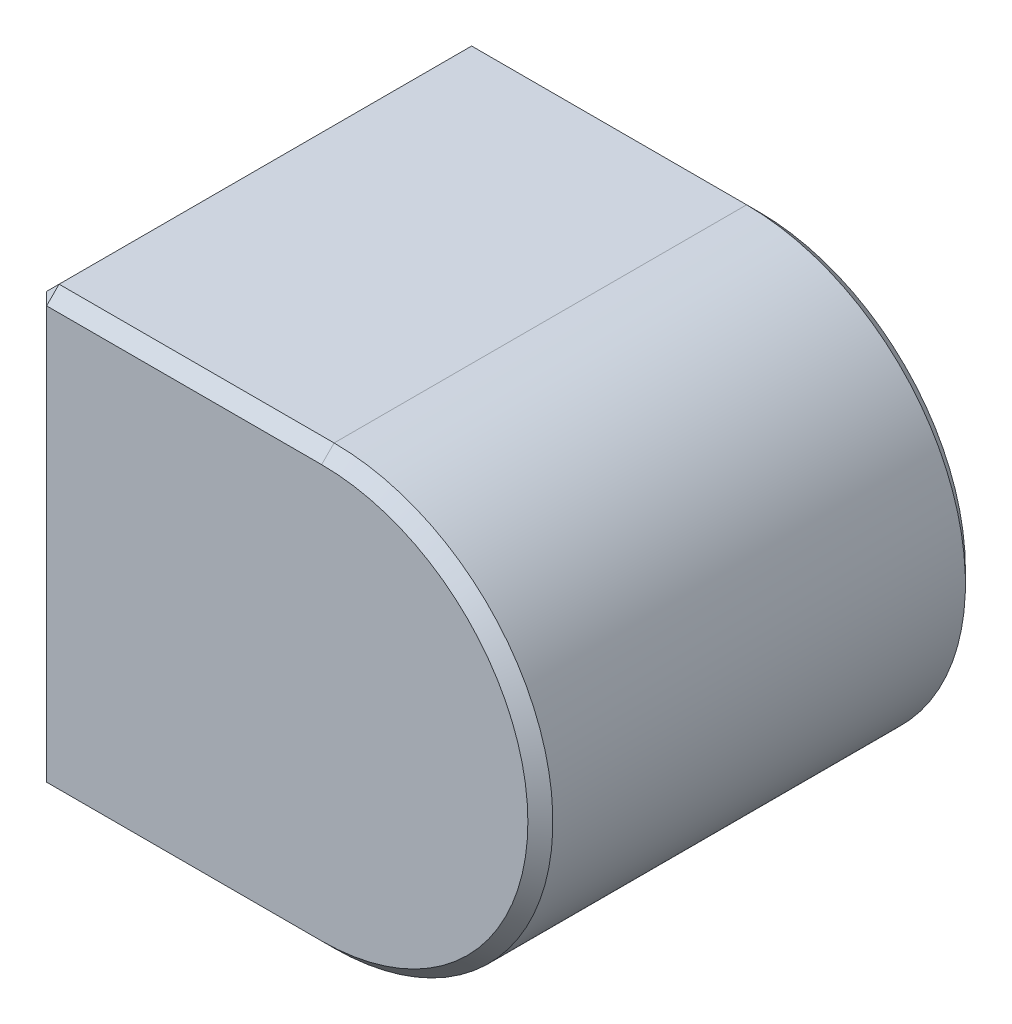
ISO-10303-21;
HEADER;
FILE_DESCRIPTION(('STEP AP214'),'2;1');
FILE_NAME('part.step','',(''),(''),'','','');
FILE_SCHEMA(('AUTOMOTIVE_DESIGN { 1 0 10303 214 1 1 1 1 }'));
ENDSEC;
DATA;
#1=APPLICATION_CONTEXT('core data for automotive mechanical design processes');
#2=APPLICATION_PROTOCOL_DEFINITION('international standard','automotive_design',2000,#1);
#3=PRODUCT_CONTEXT('',#1,'mechanical');
#4=PRODUCT('Part','Part','',(#3));
#5=PRODUCT_RELATED_PRODUCT_CATEGORY('part','',(#4));
#6=PRODUCT_DEFINITION_FORMATION('','',#4);
#7=PRODUCT_DEFINITION_CONTEXT('part definition',#1,'design');
#8=PRODUCT_DEFINITION('design','',#6,#7);
#9=PRODUCT_DEFINITION_SHAPE('','',#8);
#10=(LENGTH_UNIT() NAMED_UNIT(*) SI_UNIT(.MILLI.,.METRE.));
#11=(NAMED_UNIT(*) PLANE_ANGLE_UNIT() SI_UNIT($,.RADIAN.));
#12=(NAMED_UNIT(*) SI_UNIT($,.STERADIAN.) SOLID_ANGLE_UNIT());
#13=UNCERTAINTY_MEASURE_WITH_UNIT(LENGTH_MEASURE(1.E-05),#10,'distance_accuracy_value','');
#14=(GEOMETRIC_REPRESENTATION_CONTEXT(3) GLOBAL_UNCERTAINTY_ASSIGNED_CONTEXT((#13)) GLOBAL_UNIT_ASSIGNED_CONTEXT((#10,
#11,#12)) REPRESENTATION_CONTEXT('',''));
#15=CARTESIAN_POINT('',(0.,0.,0.));
#16=DIRECTION('',(0.,0.,1.));
#17=DIRECTION('',(1.,0.,0.));
#18=AXIS2_PLACEMENT_3D('',#15,#16,#17);
#19=CARTESIAN_POINT('',(0.,0.,70.));
#20=DIRECTION('',(0.,0.,-1.));
#21=DIRECTION('',(1.,0.,0.));
#22=AXIS2_PLACEMENT_3D('',#19,#20,#21);
#23=CYLINDRICAL_SURFACE('',#22,35.);
#24=DIRECTION('',(0.,0.,-1.));
#25=VECTOR('',#24,1.);
#26=CARTESIAN_POINT('',(0.,35.,70.));
#27=LINE('',#26,#25);
#28=CARTESIAN_POINT('',(0.,35.,68.));
#29=VERTEX_POINT('',#28);
#30=CARTESIAN_POINT('',(0.,35.,2.));
#31=VERTEX_POINT('',#30);
#32=EDGE_CURVE('E147',#29,#31,#27,.T.);
#33=ORIENTED_EDGE('',*,*,#32,.F.);
#34=CARTESIAN_POINT('',(0.,0.,68.));
#35=DIRECTION('',(0.,0.,-1.));
#36=DIRECTION('',(-1.,0.,0.));
#37=AXIS2_PLACEMENT_3D('',#34,#35,#36);
#38=CIRCLE('',#37,35.);
#39=CARTESIAN_POINT('',(0.,-35.,68.));
#40=VERTEX_POINT('',#39);
#41=EDGE_CURVE('E116',#40,#29,#38,.F.);
#42=ORIENTED_EDGE('',*,*,#41,.F.);
#43=DIRECTION('',(0.,0.,-1.));
#44=VECTOR('',#43,1.);
#45=CARTESIAN_POINT('',(0.,-35.,70.));
#46=LINE('',#45,#44);
#47=CARTESIAN_POINT('',(0.,-35.,2.));
#48=VERTEX_POINT('',#47);
#49=EDGE_CURVE('E141',#40,#48,#46,.T.);
#50=ORIENTED_EDGE('',*,*,#49,.T.);
#51=CARTESIAN_POINT('',(0.,0.,2.));
#52=DIRECTION('',(0.,0.,-1.));
#53=DIRECTION('',(-1.,0.,0.));
#54=AXIS2_PLACEMENT_3D('',#51,#52,#53);
#55=CIRCLE('',#54,35.);
#56=EDGE_CURVE('E150',#31,#48,#55,.T.);
#57=ORIENTED_EDGE('',*,*,#56,.F.);
#58=EDGE_LOOP('',(#33,#42,#50,#57));
#59=FACE_BOUND('',#58,.T.);
#60=ADVANCED_FACE('F32',(#59),#23,.T.);
#61=CARTESIAN_POINT('',(-46.,-35.,70.));
#62=DIRECTION('',(0.,1.,0.));
#63=DIRECTION('',(1.,0.,0.));
#64=AXIS2_PLACEMENT_3D('',#61,#62,#63);
#65=PLANE('',#64);
#66=ORIENTED_EDGE('',*,*,#49,.F.);
#67=DIRECTION('',(1.,0.,0.));
#68=VECTOR('',#67,1.);
#69=CARTESIAN_POINT('',(0.,-35.,68.));
#70=LINE('',#69,#68);
#71=CARTESIAN_POINT('',(-44.,-35.,68.));
#72=VERTEX_POINT('',#71);
#73=EDGE_CURVE('E128',#72,#40,#70,.T.);
#74=ORIENTED_EDGE('',*,*,#73,.F.);
#75=DIRECTION('',(0.,0.,1.));
#76=VECTOR('',#75,1.);
#77=CARTESIAN_POINT('',(-44.,-35.,70.));
#78=LINE('',#77,#76);
#79=CARTESIAN_POINT('',(-44.,-35.,2.));
#80=VERTEX_POINT('',#79);
#81=EDGE_CURVE('E137',#80,#72,#78,.T.);
#82=ORIENTED_EDGE('',*,*,#81,.F.);
#83=DIRECTION('',(-1.,0.,0.));
#84=VECTOR('',#83,1.);
#85=CARTESIAN_POINT('',(-46.,-35.,2.));
#86=LINE('',#85,#84);
#87=EDGE_CURVE('E136',#48,#80,#86,.T.);
#88=ORIENTED_EDGE('',*,*,#87,.F.);
#89=EDGE_LOOP('',(#66,#74,#82,#88));
#90=FACE_BOUND('',#89,.T.);
#91=ADVANCED_FACE('F142',(#90),#65,.F.);
#92=CARTESIAN_POINT('',(-46.,35.,70.));
#93=DIRECTION('',(1.,0.,0.));
#94=DIRECTION('',(0.,0.,1.));
#95=AXIS2_PLACEMENT_3D('',#92,#93,#94);
#96=PLANE('',#95);
#97=CARTESIAN_POINT('',(-46.,0.,38.));
#98=DIRECTION('',(-1.,0.,0.));
#99=DIRECTION('',(0.,0.,1.));
#100=AXIS2_PLACEMENT_3D('',#97,#98,#99);
#101=CIRCLE('',#100,26.);
#102=CARTESIAN_POINT('',(-46.,0.,64.));
#103=VERTEX_POINT('',#102);
#104=EDGE_CURVE('E40',#103,#103,#101,.T.);
#105=ORIENTED_EDGE('',*,*,#104,.F.);
#106=EDGE_LOOP('',(#105));
#107=FACE_BOUND('',#106,.T.);
#108=DIRECTION('',(0.,-1.,0.));
#109=VECTOR('',#108,1.);
#110=CARTESIAN_POINT('',(-46.,-35.,68.));
#111=LINE('',#110,#109);
#112=CARTESIAN_POINT('',(-46.,33.,68.));
#113=VERTEX_POINT('',#112);
#114=CARTESIAN_POINT('',(-46.,-33.,68.));
#115=VERTEX_POINT('',#114);
#116=EDGE_CURVE('E153',#113,#115,#111,.T.);
#117=ORIENTED_EDGE('',*,*,#116,.F.);
#118=DIRECTION('',(0.,0.,1.));
#119=VECTOR('',#118,1.);
#120=CARTESIAN_POINT('',(-46.,33.,70.));
#121=LINE('',#120,#119);
#122=CARTESIAN_POINT('',(-46.,33.,1.99999999999999));
#123=VERTEX_POINT('',#122);
#124=EDGE_CURVE('E160',#123,#113,#121,.T.);
#125=ORIENTED_EDGE('',*,*,#124,.F.);
#126=DIRECTION('',(0.,1.,0.));
#127=VECTOR('',#126,1.);
#128=CARTESIAN_POINT('',(-46.,35.,1.99999999999999));
#129=LINE('',#128,#127);
#130=CARTESIAN_POINT('',(-46.,-33.,1.99999999999999));
#131=VERTEX_POINT('',#130);
#132=EDGE_CURVE('E162',#131,#123,#129,.T.);
#133=ORIENTED_EDGE('',*,*,#132,.F.);
#134=DIRECTION('',(0.,0.,-1.));
#135=VECTOR('',#134,1.);
#136=CARTESIAN_POINT('',(-46.,-33.,70.));
#137=LINE('',#136,#135);
#138=EDGE_CURVE('E165',#115,#131,#137,.T.);
#139=ORIENTED_EDGE('',*,*,#138,.F.);
#140=EDGE_LOOP('',(#117,#125,#133,#139));
#141=FACE_BOUND('',#140,.T.);
#142=ADVANCED_FACE('F226',(#107,#141),#96,.F.);
#143=CARTESIAN_POINT('',(0.,35.,70.));
#144=DIRECTION('',(0.,-1.,0.));
#145=DIRECTION('',(-1.,0.,0.));
#146=AXIS2_PLACEMENT_3D('',#143,#144,#145);
#147=PLANE('',#146);
#148=DIRECTION('',(0.,0.,-1.));
#149=VECTOR('',#148,1.);
#150=CARTESIAN_POINT('',(-44.,35.,70.));
#151=LINE('',#150,#149);
#152=CARTESIAN_POINT('',(-44.,35.,68.));
#153=VERTEX_POINT('',#152);
#154=CARTESIAN_POINT('',(-44.,35.,2.));
#155=VERTEX_POINT('',#154);
#156=EDGE_CURVE('E171',#153,#155,#151,.T.);
#157=ORIENTED_EDGE('',*,*,#156,.F.);
#158=DIRECTION('',(-1.,0.,0.));
#159=VECTOR('',#158,1.);
#160=CARTESIAN_POINT('',(-46.,35.,68.));
#161=LINE('',#160,#159);
#162=EDGE_CURVE('E168',#29,#153,#161,.T.);
#163=ORIENTED_EDGE('',*,*,#162,.F.);
#164=ORIENTED_EDGE('',*,*,#32,.T.);
#165=DIRECTION('',(1.,0.,0.));
#166=VECTOR('',#165,1.);
#167=CARTESIAN_POINT('',(0.,35.,2.));
#168=LINE('',#167,#166);
#169=EDGE_CURVE('E173',#155,#31,#168,.T.);
#170=ORIENTED_EDGE('',*,*,#169,.F.);
#171=EDGE_LOOP('',(#157,#163,#164,#170));
#172=FACE_BOUND('',#171,.T.);
#173=ADVANCED_FACE('F229',(#172),#147,.F.);
#174=CARTESIAN_POINT('',(0.,0.,70.));
#175=DIRECTION('',(0.,0.,1.));
#176=DIRECTION('',(-1.,0.,0.));
#177=AXIS2_PLACEMENT_3D('',#174,#175,#176);
#178=PLANE('',#177);
#179=CARTESIAN_POINT('',(0.,0.,70.));
#180=DIRECTION('',(0.,0.,-1.));
#181=DIRECTION('',(-1.,0.,0.));
#182=AXIS2_PLACEMENT_3D('',#179,#180,#181);
#183=CIRCLE('',#182,33.);
#184=CARTESIAN_POINT('',(0.,33.,70.));
#185=VERTEX_POINT('',#184);
#186=CARTESIAN_POINT('',(0.,-33.,70.));
#187=VERTEX_POINT('',#186);
#188=EDGE_CURVE('E119',#185,#187,#183,.T.);
#189=ORIENTED_EDGE('',*,*,#188,.F.);
#190=DIRECTION('',(1.,0.,0.));
#191=VECTOR('',#190,1.);
#192=CARTESIAN_POINT('',(0.,33.,70.));
#193=LINE('',#192,#191);
#194=CARTESIAN_POINT('',(-44.,33.,70.));
#195=VERTEX_POINT('',#194);
#196=EDGE_CURVE('E266',#195,#185,#193,.T.);
#197=ORIENTED_EDGE('',*,*,#196,.F.);
#198=DIRECTION('',(0.,1.,0.));
#199=VECTOR('',#198,1.);
#200=CARTESIAN_POINT('',(-44.,35.,70.));
#201=LINE('',#200,#199);
#202=CARTESIAN_POINT('',(-44.,-33.,70.));
#203=VERTEX_POINT('',#202);
#204=EDGE_CURVE('E240',#203,#195,#201,.T.);
#205=ORIENTED_EDGE('',*,*,#204,.F.);
#206=DIRECTION('',(-1.,0.,0.));
#207=VECTOR('',#206,1.);
#208=CARTESIAN_POINT('',(-46.,-33.,70.));
#209=LINE('',#208,#207);
#210=EDGE_CURVE('E151',#187,#203,#209,.T.);
#211=ORIENTED_EDGE('',*,*,#210,.F.);
#212=EDGE_LOOP('',(#189,#197,#205,#211));
#213=FACE_BOUND('',#212,.T.);
#214=ADVANCED_FACE('F264',(#213),#178,.T.);
#215=CARTESIAN_POINT('',(0.,0.,0.));
#216=DIRECTION('',(0.,0.,1.));
#217=DIRECTION('',(-1.,0.,0.));
#218=AXIS2_PLACEMENT_3D('',#215,#216,#217);
#219=PLANE('',#218);
#220=CARTESIAN_POINT('',(0.,0.,0.));
#221=DIRECTION('',(0.,0.,-1.));
#222=DIRECTION('',(-1.,0.,0.));
#223=AXIS2_PLACEMENT_3D('',#220,#221,#222);
#224=CIRCLE('',#223,27.);
#225=CARTESIAN_POINT('',(-27.,0.,0.));
#226=VERTEX_POINT('',#225);
#227=EDGE_CURVE('E11',#226,#226,#224,.T.);
#228=ORIENTED_EDGE('',*,*,#227,.F.);
#229=EDGE_LOOP('',(#228));
#230=FACE_BOUND('',#229,.T.);
#231=DIRECTION('',(0.,-1.,0.));
#232=VECTOR('',#231,1.);
#233=CARTESIAN_POINT('',(-44.,0.,0.));
#234=LINE('',#233,#232);
#235=CARTESIAN_POINT('',(-44.,33.,0.));
#236=VERTEX_POINT('',#235);
#237=CARTESIAN_POINT('',(-44.,-33.,0.));
#238=VERTEX_POINT('',#237);
#239=EDGE_CURVE('E255',#236,#238,#234,.T.);
#240=ORIENTED_EDGE('',*,*,#239,.F.);
#241=DIRECTION('',(-1.,0.,0.));
#242=VECTOR('',#241,1.);
#243=CARTESIAN_POINT('',(0.,33.,0.));
#244=LINE('',#243,#242);
#245=CARTESIAN_POINT('',(0.,33.,0.));
#246=VERTEX_POINT('',#245);
#247=EDGE_CURVE('E277',#246,#236,#244,.T.);
#248=ORIENTED_EDGE('',*,*,#247,.F.);
#249=CARTESIAN_POINT('',(0.,0.,0.));
#250=DIRECTION('',(0.,0.,-1.));
#251=DIRECTION('',(-1.,0.,0.));
#252=AXIS2_PLACEMENT_3D('',#249,#250,#251);
#253=CIRCLE('',#252,33.);
#254=CARTESIAN_POINT('',(0.,-33.,0.));
#255=VERTEX_POINT('',#254);
#256=EDGE_CURVE('E273',#255,#246,#253,.F.);
#257=ORIENTED_EDGE('',*,*,#256,.F.);
#258=DIRECTION('',(1.,0.,0.));
#259=VECTOR('',#258,1.);
#260=CARTESIAN_POINT('',(0.,-33.,0.));
#261=LINE('',#260,#259);
#262=EDGE_CURVE('E268',#238,#255,#261,.T.);
#263=ORIENTED_EDGE('',*,*,#262,.F.);
#264=EDGE_LOOP('',(#240,#248,#257,#263));
#265=FACE_BOUND('',#264,.T.);
#266=ADVANCED_FACE('F480',(#230,#265),#219,.F.);
#267=CARTESIAN_POINT('',(-51.,0.,38.));
#268=DIRECTION('',(1.,0.,0.));
#269=DIRECTION('',(0.,0.,1.));
#270=AXIS2_PLACEMENT_3D('',#267,#268,#269);
#271=CYLINDRICAL_SURFACE('',#270,25.);
#272=CARTESIAN_POINT('',(-50.,0.,38.));
#273=DIRECTION('',(1.,0.,0.));
#274=DIRECTION('',(0.,0.,-1.));
#275=AXIS2_PLACEMENT_3D('',#272,#273,#274);
#276=CIRCLE('',#275,25.);
#277=CARTESIAN_POINT('',(-50.,0.,13.));
#278=VERTEX_POINT('',#277);
#279=EDGE_CURVE('E218',#278,#278,#276,.F.);
#280=ORIENTED_EDGE('',*,*,#279,.F.);
#281=EDGE_LOOP('',(#280));
#282=FACE_BOUND('',#281,.T.);
#283=CARTESIAN_POINT('',(-47.,0.,38.));
#284=DIRECTION('',(-1.,0.,0.));
#285=DIRECTION('',(0.,0.,1.));
#286=AXIS2_PLACEMENT_3D('',#283,#284,#285);
#287=CIRCLE('',#286,25.);
#288=CARTESIAN_POINT('',(-47.,0.,63.));
#289=VERTEX_POINT('',#288);
#290=EDGE_CURVE('E215',#289,#289,#287,.F.);
#291=ORIENTED_EDGE('',*,*,#290,.F.);
#292=EDGE_LOOP('',(#291));
#293=FACE_BOUND('',#292,.T.);
#294=ADVANCED_FACE('F293',(#282,#293),#271,.T.);
#295=CARTESIAN_POINT('',(-51.,0.,38.));
#296=DIRECTION('',(-1.,0.,0.));
#297=DIRECTION('',(0.,0.,-1.));
#298=AXIS2_PLACEMENT_3D('',#295,#296,#297);
#299=PLANE('',#298);
#300=CARTESIAN_POINT('',(-51.,0.,38.));
#301=DIRECTION('',(1.,0.,0.));
#302=DIRECTION('',(0.,0.,-1.));
#303=AXIS2_PLACEMENT_3D('',#300,#301,#302);
#304=CIRCLE('',#303,24.);
#305=CARTESIAN_POINT('',(-51.,0.,14.));
#306=VERTEX_POINT('',#305);
#307=EDGE_CURVE('E212',#306,#306,#304,.T.);
#308=ORIENTED_EDGE('',*,*,#307,.F.);
#309=EDGE_LOOP('',(#308));
#310=FACE_BOUND('',#309,.T.);
#311=ADVANCED_FACE('F286',(#310),#299,.T.);
#312=CARTESIAN_POINT('',(0.,33.,70.));
#313=DIRECTION('',(0.,0.70710678118655,0.707106781186545));
#314=DIRECTION('',(-1.,0.,0.));
#315=AXIS2_PLACEMENT_3D('',#312,#313,#314);
#316=PLANE('',#315);
#317=DIRECTION('',(0.,-0.707106781186545,0.70710678118655));
#318=VECTOR('',#317,1.);
#319=CARTESIAN_POINT('',(-44.,34.,69.));
#320=LINE('',#319,#318);
#321=EDGE_CURVE('E123',#153,#195,#320,.T.);
#322=ORIENTED_EDGE('',*,*,#321,.T.);
#323=ORIENTED_EDGE('',*,*,#196,.T.);
#324=DIRECTION('',(0.,0.707106781186545,-0.70710678118655));
#325=VECTOR('',#324,1.);
#326=CARTESIAN_POINT('',(0.,33.,70.));
#327=LINE('',#326,#325);
#328=EDGE_CURVE('E202',#185,#29,#327,.T.);
#329=ORIENTED_EDGE('',*,*,#328,.T.);
#330=ORIENTED_EDGE('',*,*,#162,.T.);
#331=EDGE_LOOP('',(#322,#323,#329,#330));
#332=FACE_BOUND('',#331,.T.);
#333=ADVANCED_FACE('F284',(#332),#316,.T.);
#334=CARTESIAN_POINT('',(0.,0.,70.));
#335=DIRECTION('',(0.,0.,-1.));
#336=DIRECTION('',(1.,0.,0.));
#337=AXIS2_PLACEMENT_3D('',#334,#335,#336);
#338=CONICAL_SURFACE('',#337,33.,0.785398163397445);
#339=ORIENTED_EDGE('',*,*,#328,.F.);
#340=ORIENTED_EDGE('',*,*,#188,.T.);
#341=DIRECTION('',(0.,-0.707106781186545,-0.70710678118655));
#342=VECTOR('',#341,1.);
#343=CARTESIAN_POINT('',(0.,-33.,70.));
#344=LINE('',#343,#342);
#345=EDGE_CURVE('E112',#187,#40,#344,.T.);
#346=ORIENTED_EDGE('',*,*,#345,.T.);
#347=ORIENTED_EDGE('',*,*,#41,.T.);
#348=EDGE_LOOP('',(#339,#340,#346,#347));
#349=FACE_BOUND('',#348,.T.);
#350=ADVANCED_FACE('F114',(#349),#338,.T.);
#351=CARTESIAN_POINT('',(-46.,33.,68.));
#352=DIRECTION('',(-0.577350269189626,0.57735026918963,0.577350269189622));
#353=DIRECTION('',(0.70710678118655,0.707106781186545,0.));
#354=AXIS2_PLACEMENT_3D('',#351,#352,#353);
#355=PLANE('',#354);
#356=DIRECTION('',(-0.70710678118655,-0.707106781186545,0.));
#357=VECTOR('',#356,1.);
#358=CARTESIAN_POINT('',(-46.,33.,68.));
#359=LINE('',#358,#357);
#360=EDGE_CURVE('E55',#153,#113,#359,.T.);
#361=ORIENTED_EDGE('',*,*,#360,.T.);
#362=DIRECTION('',(-0.707106781186545,0.,-0.70710678118655));
#363=VECTOR('',#362,1.);
#364=CARTESIAN_POINT('',(-46.,33.,68.));
#365=LINE('',#364,#363);
#366=EDGE_CURVE('E124',#113,#195,#365,.F.);
#367=ORIENTED_EDGE('',*,*,#366,.T.);
#368=ORIENTED_EDGE('',*,*,#321,.F.);
#369=EDGE_LOOP('',(#361,#367,#368));
#370=FACE_BOUND('',#369,.T.);
#371=ADVANCED_FACE('F243',(#370),#355,.T.);
#372=CARTESIAN_POINT('',(0.,-33.,70.));
#373=DIRECTION('',(0.,-0.70710678118655,0.707106781186545));
#374=DIRECTION('',(1.,0.,0.));
#375=AXIS2_PLACEMENT_3D('',#372,#373,#374);
#376=PLANE('',#375);
#377=ORIENTED_EDGE('',*,*,#345,.F.);
#378=ORIENTED_EDGE('',*,*,#210,.T.);
#379=DIRECTION('',(0.,-0.707106781186545,-0.70710678118655));
#380=VECTOR('',#379,1.);
#381=CARTESIAN_POINT('',(-44.,-33.,70.));
#382=LINE('',#381,#380);
#383=EDGE_CURVE('E132',#203,#72,#382,.T.);
#384=ORIENTED_EDGE('',*,*,#383,.T.);
#385=ORIENTED_EDGE('',*,*,#73,.T.);
#386=EDGE_LOOP('',(#377,#378,#384,#385));
#387=FACE_BOUND('',#386,.T.);
#388=ADVANCED_FACE('F130',(#387),#376,.T.);
#389=CARTESIAN_POINT('',(-44.,0.,70.));
#390=DIRECTION('',(-0.70710678118655,0.,0.707106781186545));
#391=DIRECTION('',(0.,-1.,0.));
#392=AXIS2_PLACEMENT_3D('',#389,#390,#391);
#393=PLANE('',#392);
#394=ORIENTED_EDGE('',*,*,#366,.F.);
#395=ORIENTED_EDGE('',*,*,#116,.T.);
#396=DIRECTION('',(0.707106781186545,0.,0.70710678118655));
#397=VECTOR('',#396,1.);
#398=CARTESIAN_POINT('',(-44.,-33.,70.));
#399=LINE('',#398,#397);
#400=EDGE_CURVE('E195',#115,#203,#399,.T.);
#401=ORIENTED_EDGE('',*,*,#400,.T.);
#402=ORIENTED_EDGE('',*,*,#204,.T.);
#403=EDGE_LOOP('',(#394,#395,#401,#402));
#404=FACE_BOUND('',#403,.T.);
#405=ADVANCED_FACE('F236',(#404),#393,.T.);
#406=CARTESIAN_POINT('',(-44.,35.,70.));
#407=DIRECTION('',(0.707106781186545,-0.70710678118655,0.));
#408=DIRECTION('',(0.,0.,-1.));
#409=AXIS2_PLACEMENT_3D('',#406,#407,#408);
#410=PLANE('',#409);
#411=ORIENTED_EDGE('',*,*,#360,.F.);
#412=ORIENTED_EDGE('',*,*,#156,.T.);
#413=DIRECTION('',(0.70710678118655,0.707106781186545,0.));
#414=VECTOR('',#413,1.);
#415=CARTESIAN_POINT('',(-46.,33.,1.99999999999999));
#416=LINE('',#415,#414);
#417=EDGE_CURVE('E192',#155,#123,#416,.F.);
#418=ORIENTED_EDGE('',*,*,#417,.T.);
#419=ORIENTED_EDGE('',*,*,#124,.T.);
#420=EDGE_LOOP('',(#411,#412,#418,#419));
#421=FACE_BOUND('',#420,.T.);
#422=ADVANCED_FACE('F244',(#421),#410,.F.);
#423=CARTESIAN_POINT('',(-44.,-33.,70.));
#424=DIRECTION('',(-0.577350269189626,-0.57735026918963,0.577350269189622));
#425=DIRECTION('',(-0.70710678118655,0.707106781186545,0.));
#426=AXIS2_PLACEMENT_3D('',#423,#424,#425);
#427=PLANE('',#426);
#428=ORIENTED_EDGE('',*,*,#400,.F.);
#429=DIRECTION('',(0.70710678118655,-0.707106781186545,0.));
#430=VECTOR('',#429,1.);
#431=CARTESIAN_POINT('',(-45.,-34.,68.));
#432=LINE('',#431,#430);
#433=EDGE_CURVE('E189',#115,#72,#432,.T.);
#434=ORIENTED_EDGE('',*,*,#433,.T.);
#435=ORIENTED_EDGE('',*,*,#383,.F.);
#436=EDGE_LOOP('',(#428,#434,#435));
#437=FACE_BOUND('',#436,.T.);
#438=ADVANCED_FACE('F262',(#437),#427,.T.);
#439=CARTESIAN_POINT('',(-46.,33.,1.99999999999999));
#440=DIRECTION('',(-0.577350269189622,0.57735026918963,-0.577350269189626));
#441=DIRECTION('',(0.,0.707106781186545,0.70710678118655));
#442=AXIS2_PLACEMENT_3D('',#439,#440,#441);
#443=PLANE('',#442);
#444=DIRECTION('',(-0.70710678118655,0.,0.707106781186545));
#445=VECTOR('',#444,1.);
#446=CARTESIAN_POINT('',(-46.,33.,1.99999999999999));
#447=LINE('',#446,#445);
#448=EDGE_CURVE('E187',#236,#123,#447,.T.);
#449=ORIENTED_EDGE('',*,*,#448,.T.);
#450=ORIENTED_EDGE('',*,*,#417,.F.);
#451=DIRECTION('',(0.,-0.707106781186545,-0.70710678118655));
#452=VECTOR('',#451,1.);
#453=CARTESIAN_POINT('',(-44.,34.,1.));
#454=LINE('',#453,#452);
#455=EDGE_CURVE('E47',#155,#236,#454,.T.);
#456=ORIENTED_EDGE('',*,*,#455,.T.);
#457=EDGE_LOOP('',(#449,#450,#456));
#458=FACE_BOUND('',#457,.T.);
#459=ADVANCED_FACE('F322',(#458),#443,.T.);
#460=CARTESIAN_POINT('',(0.,35.,2.));
#461=DIRECTION('',(0.,-0.70710678118655,0.707106781186545));
#462=DIRECTION('',(1.,0.,0.));
#463=AXIS2_PLACEMENT_3D('',#460,#461,#462);
#464=PLANE('',#463);
#465=ORIENTED_EDGE('',*,*,#455,.F.);
#466=ORIENTED_EDGE('',*,*,#169,.T.);
#467=DIRECTION('',(0.,-0.707106781186545,-0.70710678118655));
#468=VECTOR('',#467,1.);
#469=CARTESIAN_POINT('',(0.,35.,2.));
#470=LINE('',#469,#468);
#471=EDGE_CURVE('E185',#31,#246,#470,.T.);
#472=ORIENTED_EDGE('',*,*,#471,.T.);
#473=ORIENTED_EDGE('',*,*,#247,.T.);
#474=EDGE_LOOP('',(#465,#466,#472,#473));
#475=FACE_BOUND('',#474,.T.);
#476=ADVANCED_FACE('F319',(#475),#464,.F.);
#477=CARTESIAN_POINT('',(-46.,-33.,70.));
#478=DIRECTION('',(0.707106781186545,0.70710678118655,0.));
#479=DIRECTION('',(0.,0.,-1.));
#480=AXIS2_PLACEMENT_3D('',#477,#478,#479);
#481=PLANE('',#480);
#482=ORIENTED_EDGE('',*,*,#433,.F.);
#483=ORIENTED_EDGE('',*,*,#138,.T.);
#484=DIRECTION('',(-0.70710678118655,0.707106781186545,0.));
#485=VECTOR('',#484,1.);
#486=CARTESIAN_POINT('',(-44.,-35.,2.));
#487=LINE('',#486,#485);
#488=EDGE_CURVE('E182',#131,#80,#487,.F.);
#489=ORIENTED_EDGE('',*,*,#488,.T.);
#490=ORIENTED_EDGE('',*,*,#81,.T.);
#491=EDGE_LOOP('',(#482,#483,#489,#490));
#492=FACE_BOUND('',#491,.T.);
#493=ADVANCED_FACE('F260',(#492),#481,.F.);
#494=CARTESIAN_POINT('',(-46.,35.,1.99999999999999));
#495=DIRECTION('',(0.707106781186545,0.,0.70710678118655));
#496=DIRECTION('',(0.,1.,0.));
#497=AXIS2_PLACEMENT_3D('',#494,#495,#496);
#498=PLANE('',#497);
#499=ORIENTED_EDGE('',*,*,#448,.F.);
#500=ORIENTED_EDGE('',*,*,#239,.T.);
#501=DIRECTION('',(0.70710678118655,0.,-0.707106781186545));
#502=VECTOR('',#501,1.);
#503=CARTESIAN_POINT('',(-45.,-33.,0.999999999999994));
#504=LINE('',#503,#502);
#505=EDGE_CURVE('E180',#238,#131,#504,.F.);
#506=ORIENTED_EDGE('',*,*,#505,.T.);
#507=ORIENTED_EDGE('',*,*,#132,.T.);
#508=EDGE_LOOP('',(#499,#500,#506,#507));
#509=FACE_BOUND('',#508,.T.);
#510=ADVANCED_FACE('F250',(#509),#498,.F.);
#511=CARTESIAN_POINT('',(0.,0.,2.));
#512=DIRECTION('',(0.,0.,1.));
#513=DIRECTION('',(-1.,0.,0.));
#514=AXIS2_PLACEMENT_3D('',#511,#512,#513);
#515=CONICAL_SURFACE('',#514,35.,0.785398163397445);
#516=ORIENTED_EDGE('',*,*,#471,.F.);
#517=ORIENTED_EDGE('',*,*,#56,.T.);
#518=DIRECTION('',(0.,0.707106781186545,-0.70710678118655));
#519=VECTOR('',#518,1.);
#520=CARTESIAN_POINT('',(0.,-35.,2.));
#521=LINE('',#520,#519);
#522=EDGE_CURVE('E178',#48,#255,#521,.T.);
#523=ORIENTED_EDGE('',*,*,#522,.T.);
#524=ORIENTED_EDGE('',*,*,#256,.T.);
#525=EDGE_LOOP('',(#516,#517,#523,#524));
#526=FACE_BOUND('',#525,.T.);
#527=ADVANCED_FACE('F311',(#526),#515,.T.);
#528=CARTESIAN_POINT('',(-44.,-35.,2.));
#529=DIRECTION('',(-0.577350269189622,-0.57735026918963,-0.577350269189626));
#530=DIRECTION('',(0.,0.707106781186545,-0.70710678118655));
#531=AXIS2_PLACEMENT_3D('',#528,#529,#530);
#532=PLANE('',#531);
#533=ORIENTED_EDGE('',*,*,#505,.F.);
#534=DIRECTION('',(0.,-0.707106781186545,0.70710678118655));
#535=VECTOR('',#534,1.);
#536=CARTESIAN_POINT('',(-44.,-35.,2.));
#537=LINE('',#536,#535);
#538=EDGE_CURVE('E176',#238,#80,#537,.T.);
#539=ORIENTED_EDGE('',*,*,#538,.T.);
#540=ORIENTED_EDGE('',*,*,#488,.F.);
#541=EDGE_LOOP('',(#533,#539,#540));
#542=FACE_BOUND('',#541,.T.);
#543=ADVANCED_FACE('F258',(#542),#532,.T.);
#544=CARTESIAN_POINT('',(-46.,-35.,2.));
#545=DIRECTION('',(0.,0.70710678118655,0.707106781186545));
#546=DIRECTION('',(-1.,0.,0.));
#547=AXIS2_PLACEMENT_3D('',#544,#545,#546);
#548=PLANE('',#547);
#549=ORIENTED_EDGE('',*,*,#522,.F.);
#550=ORIENTED_EDGE('',*,*,#87,.T.);
#551=ORIENTED_EDGE('',*,*,#538,.F.);
#552=ORIENTED_EDGE('',*,*,#262,.T.);
#553=EDGE_LOOP('',(#549,#550,#551,#552));
#554=FACE_BOUND('',#553,.T.);
#555=ADVANCED_FACE('F304',(#554),#548,.F.);
#556=CARTESIAN_POINT('',(0.,0.,5.));
#557=DIRECTION('',(0.,0.,-1.));
#558=DIRECTION('',(1.,0.,0.));
#559=AXIS2_PLACEMENT_3D('',#556,#557,#558);
#560=CYLINDRICAL_SURFACE('',#559,26.);
#561=CARTESIAN_POINT('',(0.,0.,4.));
#562=DIRECTION('',(0.,0.,1.));
#563=DIRECTION('',(1.,0.,0.));
#564=AXIS2_PLACEMENT_3D('',#561,#562,#563);
#565=CIRCLE('',#564,26.);
#566=CARTESIAN_POINT('',(26.,0.,4.));
#567=VERTEX_POINT('',#566);
#568=EDGE_CURVE('E209',#567,#567,#565,.F.);
#569=ORIENTED_EDGE('',*,*,#568,.F.);
#570=EDGE_LOOP('',(#569));
#571=FACE_BOUND('',#570,.T.);
#572=CARTESIAN_POINT('',(0.,0.,1.00000000000001));
#573=DIRECTION('',(0.,0.,-1.));
#574=DIRECTION('',(-1.,0.,0.));
#575=AXIS2_PLACEMENT_3D('',#572,#573,#574);
#576=CIRCLE('',#575,26.);
#577=CARTESIAN_POINT('',(-26.,0.,1.00000000000001));
#578=VERTEX_POINT('',#577);
#579=EDGE_CURVE('E206',#578,#578,#576,.F.);
#580=ORIENTED_EDGE('',*,*,#579,.F.);
#581=EDGE_LOOP('',(#580));
#582=FACE_BOUND('',#581,.T.);
#583=ADVANCED_FACE('F307',(#571,#582),#560,.F.);
#584=CARTESIAN_POINT('',(0.,0.,5.));
#585=DIRECTION('',(0.,0.,-1.));
#586=DIRECTION('',(1.,0.,0.));
#587=AXIS2_PLACEMENT_3D('',#584,#585,#586);
#588=PLANE('',#587);
#589=CARTESIAN_POINT('',(0.,0.,5.));
#590=DIRECTION('',(0.,0.,1.));
#591=DIRECTION('',(1.,0.,0.));
#592=AXIS2_PLACEMENT_3D('',#589,#590,#591);
#593=CIRCLE('',#592,25.);
#594=CARTESIAN_POINT('',(25.,0.,5.));
#595=VERTEX_POINT('',#594);
#596=EDGE_CURVE('E175',#595,#595,#593,.T.);
#597=ORIENTED_EDGE('',*,*,#596,.F.);
#598=EDGE_LOOP('',(#597));
#599=FACE_BOUND('',#598,.T.);
#600=ADVANCED_FACE('F388',(#599),#588,.T.);
#601=CARTESIAN_POINT('',(0.,0.,5.));
#602=DIRECTION('',(0.,0.,-1.));
#603=DIRECTION('',(1.,0.,0.));
#604=AXIS2_PLACEMENT_3D('',#601,#602,#603);
#605=CONICAL_SURFACE('',#604,25.,0.78539816339745);
#606=ORIENTED_EDGE('',*,*,#568,.T.);
#607=EDGE_LOOP('',(#606));
#608=FACE_BOUND('',#607,.T.);
#609=ORIENTED_EDGE('',*,*,#596,.T.);
#610=EDGE_LOOP('',(#609));
#611=FACE_BOUND('',#610,.T.);
#612=ADVANCED_FACE('F396',(#608,#611),#605,.F.);
#613=CARTESIAN_POINT('',(-51.,0.,38.));
#614=DIRECTION('',(1.,0.,0.));
#615=DIRECTION('',(0.,0.,1.));
#616=AXIS2_PLACEMENT_3D('',#613,#614,#615);
#617=CONICAL_SURFACE('',#616,24.,0.785398163397459);
#618=ORIENTED_EDGE('',*,*,#279,.T.);
#619=EDGE_LOOP('',(#618));
#620=FACE_BOUND('',#619,.T.);
#621=ORIENTED_EDGE('',*,*,#307,.T.);
#622=EDGE_LOOP('',(#621));
#623=FACE_BOUND('',#622,.T.);
#624=ADVANCED_FACE('F404',(#620,#623),#617,.T.);
#625=CARTESIAN_POINT('',(-47.,0.,38.));
#626=DIRECTION('',(1.,0.,0.));
#627=DIRECTION('',(0.,0.,1.));
#628=AXIS2_PLACEMENT_3D('',#625,#626,#627);
#629=CONICAL_SURFACE('',#628,25.,0.785398163397431);
#630=ORIENTED_EDGE('',*,*,#104,.T.);
#631=EDGE_LOOP('',(#630));
#632=FACE_BOUND('',#631,.T.);
#633=ORIENTED_EDGE('',*,*,#290,.T.);
#634=EDGE_LOOP('',(#633));
#635=FACE_BOUND('',#634,.T.);
#636=ADVANCED_FACE('F223',(#632,#635),#629,.T.);
#637=CARTESIAN_POINT('',(0.,0.,1.00000000000001));
#638=DIRECTION('',(0.,0.,-1.));
#639=DIRECTION('',(1.,0.,0.));
#640=AXIS2_PLACEMENT_3D('',#637,#638,#639);
#641=CONICAL_SURFACE('',#640,26.,0.785398163397447);
#642=ORIENTED_EDGE('',*,*,#227,.T.);
#643=EDGE_LOOP('',(#642));
#644=FACE_BOUND('',#643,.T.);
#645=ORIENTED_EDGE('',*,*,#579,.T.);
#646=EDGE_LOOP('',(#645));
#647=FACE_BOUND('',#646,.T.);
#648=ADVANCED_FACE('F34',(#644,#647),#641,.F.);
#649=CLOSED_SHELL('',(#60,#91,#142,#173,#214,#266,#294,#311,#333,#350,#371,#388,#405,#422,#438,
#459,#476,#493,#510,#527,#543,#555,#583,#600,#612,#624,#636,#648));
#650=MANIFOLD_SOLID_BREP('B2',#649);
#651=ADVANCED_BREP_SHAPE_REPRESENTATION('',(#18,#650),#14);
#652=SHAPE_DEFINITION_REPRESENTATION(#9,#651);
ENDSEC;
END-ISO-10303-21;
